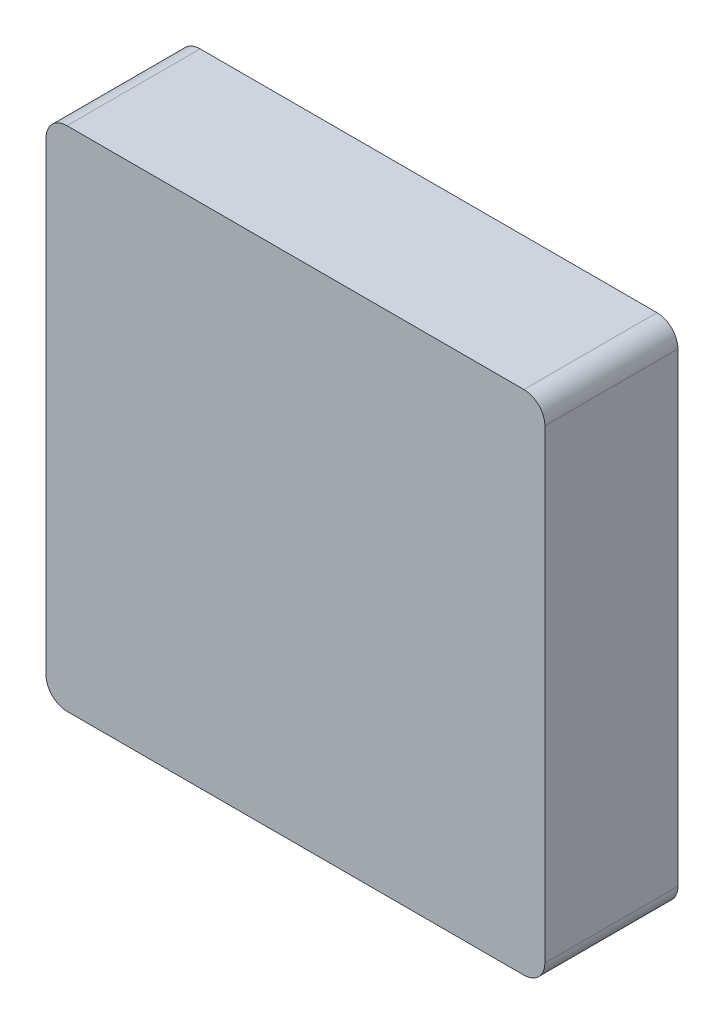
ISO-10303-21;
HEADER;
FILE_DESCRIPTION(('STEP AP214'),'2;1');
FILE_NAME('part.step','',(''),(''),'','','');
FILE_SCHEMA(('AUTOMOTIVE_DESIGN { 1 0 10303 214 1 1 1 1 }'));
ENDSEC;
DATA;
#1=APPLICATION_CONTEXT('core data for automotive mechanical design processes');
#2=APPLICATION_PROTOCOL_DEFINITION('international standard','automotive_design',2000,#1);
#3=PRODUCT_CONTEXT('',#1,'mechanical');
#4=PRODUCT('Part','Part','',(#3));
#5=PRODUCT_RELATED_PRODUCT_CATEGORY('part','',(#4));
#6=PRODUCT_DEFINITION_FORMATION('','',#4);
#7=PRODUCT_DEFINITION_CONTEXT('part definition',#1,'design');
#8=PRODUCT_DEFINITION('design','',#6,#7);
#9=PRODUCT_DEFINITION_SHAPE('','',#8);
#10=(LENGTH_UNIT() NAMED_UNIT(*) SI_UNIT(.MILLI.,.METRE.));
#11=(NAMED_UNIT(*) PLANE_ANGLE_UNIT() SI_UNIT($,.RADIAN.));
#12=(NAMED_UNIT(*) SI_UNIT($,.STERADIAN.) SOLID_ANGLE_UNIT());
#13=UNCERTAINTY_MEASURE_WITH_UNIT(LENGTH_MEASURE(1.E-05),#10,'distance_accuracy_value','');
#14=(GEOMETRIC_REPRESENTATION_CONTEXT(3) GLOBAL_UNCERTAINTY_ASSIGNED_CONTEXT((#13)) GLOBAL_UNIT_ASSIGNED_CONTEXT((#10,
#11,#12)) REPRESENTATION_CONTEXT('',''));
#15=CARTESIAN_POINT('',(0.,0.,0.));
#16=DIRECTION('',(0.,0.,1.));
#17=DIRECTION('',(1.,0.,0.));
#18=AXIS2_PLACEMENT_3D('',#15,#16,#17);
#19=CARTESIAN_POINT('',(-5.95,-6.05,3.175));
#20=DIRECTION('',(1.,0.,0.));
#21=DIRECTION('',(0.,0.,-1.));
#22=AXIS2_PLACEMENT_3D('',#19,#20,#21);
#23=PLANE('',#22);
#24=DIRECTION('',(0.,-1.,0.));
#25=VECTOR('',#24,1.);
#26=CARTESIAN_POINT('',(-5.95,-6.05,0.));
#27=LINE('',#26,#25);
#28=CARTESIAN_POINT('',(-5.95,5.55,0.));
#29=VERTEX_POINT('',#28);
#30=CARTESIAN_POINT('',(-5.95,-5.55,0.));
#31=VERTEX_POINT('',#30);
#32=EDGE_CURVE('E161',#29,#31,#27,.T.);
#33=ORIENTED_EDGE('',*,*,#32,.T.);
#34=DIRECTION('',(0.,0.,-1.));
#35=VECTOR('',#34,1.);
#36=CARTESIAN_POINT('',(-5.95,-5.55,3.175));
#37=LINE('',#36,#35);
#38=CARTESIAN_POINT('',(-5.95,-5.55,3.175));
#39=VERTEX_POINT('',#38);
#40=EDGE_CURVE('E11',#31,#39,#37,.F.);
#41=ORIENTED_EDGE('',*,*,#40,.T.);
#42=DIRECTION('',(0.,-1.,0.));
#43=VECTOR('',#42,1.);
#44=CARTESIAN_POINT('',(-5.95,-6.05,3.175));
#45=LINE('',#44,#43);
#46=CARTESIAN_POINT('',(-5.95,5.55,3.175));
#47=VERTEX_POINT('',#46);
#48=EDGE_CURVE('E129',#47,#39,#45,.T.);
#49=ORIENTED_EDGE('',*,*,#48,.F.);
#50=DIRECTION('',(0.,0.,-1.));
#51=VECTOR('',#50,1.);
#52=CARTESIAN_POINT('',(-5.95,5.55,3.175));
#53=LINE('',#52,#51);
#54=EDGE_CURVE('E45',#47,#29,#53,.T.);
#55=ORIENTED_EDGE('',*,*,#54,.T.);
#56=EDGE_LOOP('',(#33,#41,#49,#55));
#57=FACE_BOUND('',#56,.T.);
#58=ADVANCED_FACE('F37',(#57),#23,.F.);
#59=CARTESIAN_POINT('',(5.95,-6.05,3.175));
#60=DIRECTION('',(0.,1.,0.));
#61=DIRECTION('',(-1.,0.,0.));
#62=AXIS2_PLACEMENT_3D('',#59,#60,#61);
#63=PLANE('',#62);
#64=DIRECTION('',(1.,0.,0.));
#65=VECTOR('',#64,1.);
#66=CARTESIAN_POINT('',(5.95,-6.05,0.));
#67=LINE('',#66,#65);
#68=CARTESIAN_POINT('',(-5.45,-6.05,0.));
#69=VERTEX_POINT('',#68);
#70=CARTESIAN_POINT('',(5.45,-6.05,0.));
#71=VERTEX_POINT('',#70);
#72=EDGE_CURVE('E134',#69,#71,#67,.T.);
#73=ORIENTED_EDGE('',*,*,#72,.T.);
#74=DIRECTION('',(0.,0.,-1.));
#75=VECTOR('',#74,1.);
#76=CARTESIAN_POINT('',(5.45,-6.05,3.175));
#77=LINE('',#76,#75);
#78=CARTESIAN_POINT('',(5.45,-6.05,3.175));
#79=VERTEX_POINT('',#78);
#80=EDGE_CURVE('E52',#71,#79,#77,.F.);
#81=ORIENTED_EDGE('',*,*,#80,.T.);
#82=DIRECTION('',(1.,0.,0.));
#83=VECTOR('',#82,1.);
#84=CARTESIAN_POINT('',(5.95,-6.05,3.175));
#85=LINE('',#84,#83);
#86=CARTESIAN_POINT('',(-5.45,-6.05,3.175));
#87=VERTEX_POINT('',#86);
#88=EDGE_CURVE('E132',#87,#79,#85,.T.);
#89=ORIENTED_EDGE('',*,*,#88,.F.);
#90=DIRECTION('',(0.,0.,-1.));
#91=VECTOR('',#90,1.);
#92=CARTESIAN_POINT('',(-5.45,-6.05,3.175));
#93=LINE('',#92,#91);
#94=EDGE_CURVE('E153',#87,#69,#93,.T.);
#95=ORIENTED_EDGE('',*,*,#94,.T.);
#96=EDGE_LOOP('',(#73,#81,#89,#95));
#97=FACE_BOUND('',#96,.T.);
#98=ADVANCED_FACE('F181',(#97),#63,.F.);
#99=CARTESIAN_POINT('',(5.95,-6.05,3.175));
#100=DIRECTION('',(-1.,0.,0.));
#101=DIRECTION('',(0.,0.,1.));
#102=AXIS2_PLACEMENT_3D('',#99,#100,#101);
#103=PLANE('',#102);
#104=DIRECTION('',(0.,1.,0.));
#105=VECTOR('',#104,1.);
#106=CARTESIAN_POINT('',(5.95,-6.05,0.));
#107=LINE('',#106,#105);
#108=CARTESIAN_POINT('',(5.95,-5.55,0.));
#109=VERTEX_POINT('',#108);
#110=CARTESIAN_POINT('',(5.95,5.55,0.));
#111=VERTEX_POINT('',#110);
#112=EDGE_CURVE('E130',#109,#111,#107,.T.);
#113=ORIENTED_EDGE('',*,*,#112,.T.);
#114=DIRECTION('',(0.,0.,-1.));
#115=VECTOR('',#114,1.);
#116=CARTESIAN_POINT('',(5.95,5.55,3.175));
#117=LINE('',#116,#115);
#118=CARTESIAN_POINT('',(5.95,5.55,3.175));
#119=VERTEX_POINT('',#118);
#120=EDGE_CURVE('E108',#111,#119,#117,.F.);
#121=ORIENTED_EDGE('',*,*,#120,.T.);
#122=DIRECTION('',(0.,1.,0.));
#123=VECTOR('',#122,1.);
#124=CARTESIAN_POINT('',(5.95,-6.05,3.175));
#125=LINE('',#124,#123);
#126=CARTESIAN_POINT('',(5.95,-5.55,3.175));
#127=VERTEX_POINT('',#126);
#128=EDGE_CURVE('E169',#127,#119,#125,.T.);
#129=ORIENTED_EDGE('',*,*,#128,.F.);
#130=DIRECTION('',(0.,0.,-1.));
#131=VECTOR('',#130,1.);
#132=CARTESIAN_POINT('',(5.95,-5.55,3.175));
#133=LINE('',#132,#131);
#134=EDGE_CURVE('E113',#127,#109,#133,.T.);
#135=ORIENTED_EDGE('',*,*,#134,.T.);
#136=EDGE_LOOP('',(#113,#121,#129,#135));
#137=FACE_BOUND('',#136,.T.);
#138=ADVANCED_FACE('F180',(#137),#103,.F.);
#139=CARTESIAN_POINT('',(5.95,6.05,3.175));
#140=DIRECTION('',(0.,-1.,0.));
#141=DIRECTION('',(1.,0.,0.));
#142=AXIS2_PLACEMENT_3D('',#139,#140,#141);
#143=PLANE('',#142);
#144=DIRECTION('',(-1.,0.,0.));
#145=VECTOR('',#144,1.);
#146=CARTESIAN_POINT('',(5.95,6.05,3.175));
#147=LINE('',#146,#145);
#148=CARTESIAN_POINT('',(5.45,6.05,3.175));
#149=VERTEX_POINT('',#148);
#150=CARTESIAN_POINT('',(-5.45,6.05,3.175));
#151=VERTEX_POINT('',#150);
#152=EDGE_CURVE('E123',#149,#151,#147,.T.);
#153=ORIENTED_EDGE('',*,*,#152,.F.);
#154=DIRECTION('',(0.,0.,-1.));
#155=VECTOR('',#154,1.);
#156=CARTESIAN_POINT('',(5.45,6.05,3.175));
#157=LINE('',#156,#155);
#158=CARTESIAN_POINT('',(5.45,6.05,0.));
#159=VERTEX_POINT('',#158);
#160=EDGE_CURVE('E107',#149,#159,#157,.T.);
#161=ORIENTED_EDGE('',*,*,#160,.T.);
#162=DIRECTION('',(-1.,0.,0.));
#163=VECTOR('',#162,1.);
#164=CARTESIAN_POINT('',(5.95,6.05,0.));
#165=LINE('',#164,#163);
#166=CARTESIAN_POINT('',(-5.45,6.05,0.));
#167=VERTEX_POINT('',#166);
#168=EDGE_CURVE('E120',#159,#167,#165,.T.);
#169=ORIENTED_EDGE('',*,*,#168,.T.);
#170=DIRECTION('',(0.,0.,-1.));
#171=VECTOR('',#170,1.);
#172=CARTESIAN_POINT('',(-5.45,6.05,3.175));
#173=LINE('',#172,#171);
#174=EDGE_CURVE('E125',#167,#151,#173,.F.);
#175=ORIENTED_EDGE('',*,*,#174,.T.);
#176=EDGE_LOOP('',(#153,#161,#169,#175));
#177=FACE_BOUND('',#176,.T.);
#178=ADVANCED_FACE('F119',(#177),#143,.F.);
#179=CARTESIAN_POINT('',(0.,0.,3.175));
#180=DIRECTION('',(0.,0.,1.));
#181=DIRECTION('',(1.,0.,0.));
#182=AXIS2_PLACEMENT_3D('',#179,#180,#181);
#183=PLANE('',#182);
#184=ORIENTED_EDGE('',*,*,#128,.T.);
#185=CARTESIAN_POINT('',(5.45,5.55,3.175));
#186=DIRECTION('',(0.,0.,1.));
#187=DIRECTION('',(1.,0.,0.));
#188=AXIS2_PLACEMENT_3D('',#185,#186,#187);
#189=CIRCLE('',#188,0.5);
#190=EDGE_CURVE('E151',#119,#149,#189,.T.);
#191=ORIENTED_EDGE('',*,*,#190,.T.);
#192=ORIENTED_EDGE('',*,*,#152,.T.);
#193=CARTESIAN_POINT('',(-5.45,5.55,3.175));
#194=DIRECTION('',(0.,0.,1.));
#195=DIRECTION('',(1.,0.,0.));
#196=AXIS2_PLACEMENT_3D('',#193,#194,#195);
#197=CIRCLE('',#196,0.5);
#198=EDGE_CURVE('E146',#151,#47,#197,.T.);
#199=ORIENTED_EDGE('',*,*,#198,.T.);
#200=ORIENTED_EDGE('',*,*,#48,.T.);
#201=CARTESIAN_POINT('',(-5.45,-5.55,3.175));
#202=DIRECTION('',(0.,0.,1.));
#203=DIRECTION('',(1.,0.,0.));
#204=AXIS2_PLACEMENT_3D('',#201,#202,#203);
#205=CIRCLE('',#204,0.5);
#206=EDGE_CURVE('E59',#39,#87,#205,.T.);
#207=ORIENTED_EDGE('',*,*,#206,.T.);
#208=ORIENTED_EDGE('',*,*,#88,.T.);
#209=CARTESIAN_POINT('',(5.45,-5.55,3.175));
#210=DIRECTION('',(0.,0.,1.));
#211=DIRECTION('',(1.,0.,0.));
#212=AXIS2_PLACEMENT_3D('',#209,#210,#211);
#213=CIRCLE('',#212,0.5);
#214=EDGE_CURVE('E149',#79,#127,#213,.T.);
#215=ORIENTED_EDGE('',*,*,#214,.T.);
#216=EDGE_LOOP('',(#184,#191,#192,#199,#200,#207,#208,#215));
#217=FACE_BOUND('',#216,.T.);
#218=ADVANCED_FACE('F173',(#217),#183,.T.);
#219=CARTESIAN_POINT('',(0.,0.,0.));
#220=DIRECTION('',(0.,0.,1.));
#221=DIRECTION('',(1.,0.,0.));
#222=AXIS2_PLACEMENT_3D('',#219,#220,#221);
#223=PLANE('',#222);
#224=ORIENTED_EDGE('',*,*,#168,.F.);
#225=CARTESIAN_POINT('',(5.45,5.55,0.));
#226=DIRECTION('',(0.,0.,1.));
#227=DIRECTION('',(1.,0.,0.));
#228=AXIS2_PLACEMENT_3D('',#225,#226,#227);
#229=CIRCLE('',#228,0.5);
#230=EDGE_CURVE('E103',#159,#111,#229,.F.);
#231=ORIENTED_EDGE('',*,*,#230,.T.);
#232=ORIENTED_EDGE('',*,*,#112,.F.);
#233=CARTESIAN_POINT('',(5.45,-5.55,0.));
#234=DIRECTION('',(0.,0.,1.));
#235=DIRECTION('',(1.,0.,0.));
#236=AXIS2_PLACEMENT_3D('',#233,#234,#235);
#237=CIRCLE('',#236,0.5);
#238=EDGE_CURVE('E114',#109,#71,#237,.F.);
#239=ORIENTED_EDGE('',*,*,#238,.T.);
#240=ORIENTED_EDGE('',*,*,#72,.F.);
#241=CARTESIAN_POINT('',(-5.45,-5.55,0.));
#242=DIRECTION('',(0.,0.,1.));
#243=DIRECTION('',(1.,0.,0.));
#244=AXIS2_PLACEMENT_3D('',#241,#242,#243);
#245=CIRCLE('',#244,0.5);
#246=EDGE_CURVE('E140',#69,#31,#245,.F.);
#247=ORIENTED_EDGE('',*,*,#246,.T.);
#248=ORIENTED_EDGE('',*,*,#32,.F.);
#249=CARTESIAN_POINT('',(-5.45,5.55,0.));
#250=DIRECTION('',(0.,0.,1.));
#251=DIRECTION('',(1.,0.,0.));
#252=AXIS2_PLACEMENT_3D('',#249,#250,#251);
#253=CIRCLE('',#252,0.5);
#254=EDGE_CURVE('E124',#29,#167,#253,.F.);
#255=ORIENTED_EDGE('',*,*,#254,.T.);
#256=EDGE_LOOP('',(#224,#231,#232,#239,#240,#247,#248,#255));
#257=FACE_BOUND('',#256,.T.);
#258=ADVANCED_FACE('F127',(#257),#223,.F.);
#259=CARTESIAN_POINT('',(5.45,5.55,3.175));
#260=DIRECTION('',(0.,0.,-1.));
#261=DIRECTION('',(-1.,0.,0.));
#262=AXIS2_PLACEMENT_3D('',#259,#260,#261);
#263=CYLINDRICAL_SURFACE('',#262,0.5);
#264=ORIENTED_EDGE('',*,*,#190,.F.);
#265=ORIENTED_EDGE('',*,*,#120,.F.);
#266=ORIENTED_EDGE('',*,*,#230,.F.);
#267=ORIENTED_EDGE('',*,*,#160,.F.);
#268=EDGE_LOOP('',(#264,#265,#266,#267));
#269=FACE_BOUND('',#268,.T.);
#270=ADVANCED_FACE('F106',(#269),#263,.T.);
#271=CARTESIAN_POINT('',(5.45,-5.55,3.175));
#272=DIRECTION('',(0.,0.,-1.));
#273=DIRECTION('',(-1.,0.,0.));
#274=AXIS2_PLACEMENT_3D('',#271,#272,#273);
#275=CYLINDRICAL_SURFACE('',#274,0.5);
#276=ORIENTED_EDGE('',*,*,#214,.F.);
#277=ORIENTED_EDGE('',*,*,#80,.F.);
#278=ORIENTED_EDGE('',*,*,#238,.F.);
#279=ORIENTED_EDGE('',*,*,#134,.F.);
#280=EDGE_LOOP('',(#276,#277,#278,#279));
#281=FACE_BOUND('',#280,.T.);
#282=ADVANCED_FACE('F178',(#281),#275,.T.);
#283=CARTESIAN_POINT('',(-5.45,-5.55,3.175));
#284=DIRECTION('',(0.,0.,-1.));
#285=DIRECTION('',(-1.,0.,0.));
#286=AXIS2_PLACEMENT_3D('',#283,#284,#285);
#287=CYLINDRICAL_SURFACE('',#286,0.5);
#288=ORIENTED_EDGE('',*,*,#206,.F.);
#289=ORIENTED_EDGE('',*,*,#40,.F.);
#290=ORIENTED_EDGE('',*,*,#246,.F.);
#291=ORIENTED_EDGE('',*,*,#94,.F.);
#292=EDGE_LOOP('',(#288,#289,#290,#291));
#293=FACE_BOUND('',#292,.T.);
#294=ADVANCED_FACE('F183',(#293),#287,.T.);
#295=CARTESIAN_POINT('',(-5.45,5.55,3.175));
#296=DIRECTION('',(0.,0.,-1.));
#297=DIRECTION('',(-1.,0.,0.));
#298=AXIS2_PLACEMENT_3D('',#295,#296,#297);
#299=CYLINDRICAL_SURFACE('',#298,0.5);
#300=ORIENTED_EDGE('',*,*,#198,.F.);
#301=ORIENTED_EDGE('',*,*,#174,.F.);
#302=ORIENTED_EDGE('',*,*,#254,.F.);
#303=ORIENTED_EDGE('',*,*,#54,.F.);
#304=EDGE_LOOP('',(#300,#301,#302,#303));
#305=FACE_BOUND('',#304,.T.);
#306=ADVANCED_FACE('F39',(#305),#299,.T.);
#307=CLOSED_SHELL('',(#58,#98,#138,#178,#218,#258,#270,#282,#294,#306));
#308=MANIFOLD_SOLID_BREP('B2',#307);
#309=ADVANCED_BREP_SHAPE_REPRESENTATION('',(#18,#308),#14);
#310=SHAPE_DEFINITION_REPRESENTATION(#9,#309);
ENDSEC;
END-ISO-10303-21;
